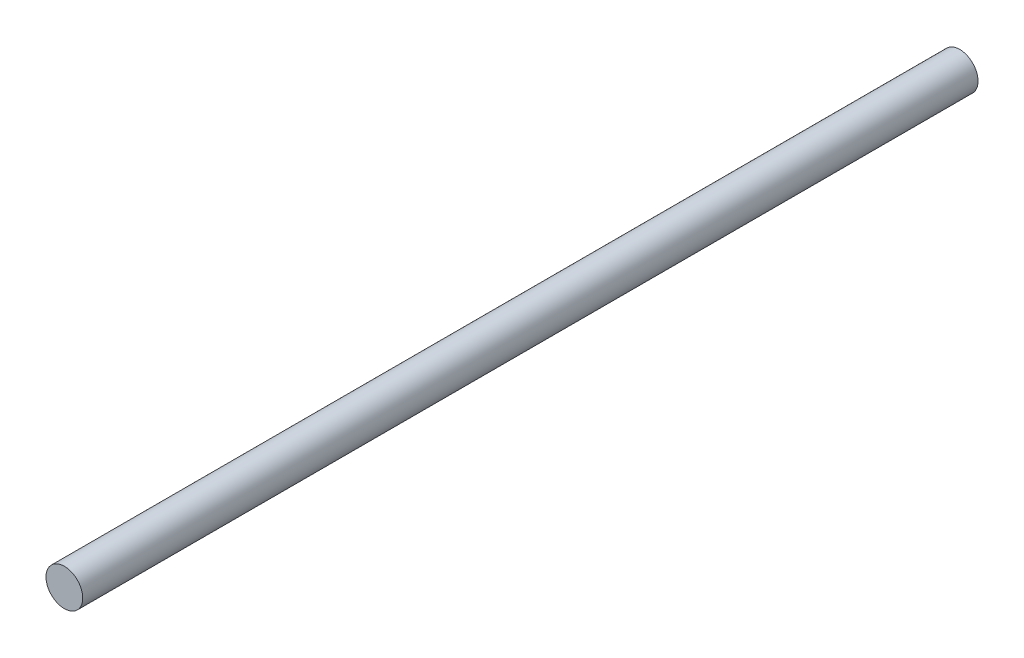
ISO-10303-21;
HEADER;
FILE_DESCRIPTION(('STEP AP214'),'2;1');
FILE_NAME('part.step','',(''),(''),'','','');
FILE_SCHEMA(('AUTOMOTIVE_DESIGN { 1 0 10303 214 1 1 1 1 }'));
ENDSEC;
DATA;
#1=APPLICATION_CONTEXT('core data for automotive mechanical design processes');
#2=APPLICATION_PROTOCOL_DEFINITION('international standard','automotive_design',2000,#1);
#3=PRODUCT_CONTEXT('',#1,'mechanical');
#4=PRODUCT('Part','Part','',(#3));
#5=PRODUCT_RELATED_PRODUCT_CATEGORY('part','',(#4));
#6=PRODUCT_DEFINITION_FORMATION('','',#4);
#7=PRODUCT_DEFINITION_CONTEXT('part definition',#1,'design');
#8=PRODUCT_DEFINITION('design','',#6,#7);
#9=PRODUCT_DEFINITION_SHAPE('','',#8);
#10=(LENGTH_UNIT() NAMED_UNIT(*) SI_UNIT(.MILLI.,.METRE.));
#11=(NAMED_UNIT(*) PLANE_ANGLE_UNIT() SI_UNIT($,.RADIAN.));
#12=(NAMED_UNIT(*) SI_UNIT($,.STERADIAN.) SOLID_ANGLE_UNIT());
#13=UNCERTAINTY_MEASURE_WITH_UNIT(LENGTH_MEASURE(1.E-05),#10,'distance_accuracy_value','');
#14=(GEOMETRIC_REPRESENTATION_CONTEXT(3) GLOBAL_UNCERTAINTY_ASSIGNED_CONTEXT((#13)) GLOBAL_UNIT_ASSIGNED_CONTEXT((#10,
#11,#12)) REPRESENTATION_CONTEXT('',''));
#15=CARTESIAN_POINT('',(0.,0.,0.));
#16=DIRECTION('',(0.,0.,1.));
#17=DIRECTION('',(1.,0.,0.));
#18=AXIS2_PLACEMENT_3D('',#15,#16,#17);
#19=CARTESIAN_POINT('',(0.,0.,1219.2));
#20=DIRECTION('',(0.,0.,-1.));
#21=DIRECTION('',(-1.,0.,0.));
#22=AXIS2_PLACEMENT_3D('',#19,#20,#21);
#23=CYLINDRICAL_SURFACE('',#22,25.);
#24=CARTESIAN_POINT('',(0.,0.,1219.2));
#25=DIRECTION('',(0.,0.,1.));
#26=DIRECTION('',(1.,0.,0.));
#27=AXIS2_PLACEMENT_3D('',#24,#25,#26);
#28=CIRCLE('',#27,25.);
#29=CARTESIAN_POINT('',(-25.,0.,1219.2));
#30=VERTEX_POINT('',#29);
#31=EDGE_CURVE('E10',#30,#30,#28,.T.);
#32=CARTESIAN_POINT('',(0.,0.,0.));
#33=DIRECTION('',(0.,0.,1.));
#34=DIRECTION('',(1.,0.,0.));
#35=AXIS2_PLACEMENT_3D('',#32,#33,#34);
#36=CIRCLE('',#35,25.);
#37=CARTESIAN_POINT('',(-25.,0.,0.));
#38=VERTEX_POINT('',#37);
#39=EDGE_CURVE('E42',#38,#38,#36,.T.);
#40=CARTESIAN_POINT('',(-25.,0.,1219.2));
#41=CARTESIAN_POINT('',(-25.,0.,1206.5));
#42=CARTESIAN_POINT('',(-25.,0.,1193.8));
#43=CARTESIAN_POINT('',(-25.,0.,1168.4));
#44=CARTESIAN_POINT('',(-25.,0.,1155.7));
#45=CARTESIAN_POINT('',(-25.,0.,1130.3));
#46=CARTESIAN_POINT('',(-25.,0.,1117.6));
#47=CARTESIAN_POINT('',(-25.,0.,1092.2));
#48=CARTESIAN_POINT('',(-25.,0.,1079.5));
#49=CARTESIAN_POINT('',(-25.,0.,1054.1));
#50=CARTESIAN_POINT('',(-25.,0.,1041.4));
#51=CARTESIAN_POINT('',(-25.,0.,1016.));
#52=CARTESIAN_POINT('',(-25.,0.,1003.3));
#53=CARTESIAN_POINT('',(-25.,0.,977.9));
#54=CARTESIAN_POINT('',(-25.,0.,965.2));
#55=CARTESIAN_POINT('',(-25.,0.,939.8));
#56=CARTESIAN_POINT('',(-25.,0.,927.1));
#57=CARTESIAN_POINT('',(-25.,0.,901.7));
#58=CARTESIAN_POINT('',(-25.,0.,889.));
#59=CARTESIAN_POINT('',(-25.,0.,863.6));
#60=CARTESIAN_POINT('',(-25.,0.,850.9));
#61=CARTESIAN_POINT('',(-25.,0.,825.5));
#62=CARTESIAN_POINT('',(-25.,0.,812.8));
#63=CARTESIAN_POINT('',(-25.,0.,787.4));
#64=CARTESIAN_POINT('',(-25.,0.,774.7));
#65=CARTESIAN_POINT('',(-25.,0.,749.3));
#66=CARTESIAN_POINT('',(-25.,0.,736.6));
#67=CARTESIAN_POINT('',(-25.,0.,711.2));
#68=CARTESIAN_POINT('',(-25.,0.,698.5));
#69=CARTESIAN_POINT('',(-25.,0.,673.1));
#70=CARTESIAN_POINT('',(-25.,0.,660.4));
#71=CARTESIAN_POINT('',(-25.,0.,635.));
#72=CARTESIAN_POINT('',(-25.,0.,622.3));
#73=CARTESIAN_POINT('',(-25.,0.,596.9));
#74=CARTESIAN_POINT('',(-25.,0.,584.2));
#75=CARTESIAN_POINT('',(-25.,0.,558.8));
#76=CARTESIAN_POINT('',(-25.,0.,546.1));
#77=CARTESIAN_POINT('',(-25.,0.,520.7));
#78=CARTESIAN_POINT('',(-25.,0.,508.));
#79=CARTESIAN_POINT('',(-25.,0.,482.6));
#80=CARTESIAN_POINT('',(-25.,0.,469.9));
#81=CARTESIAN_POINT('',(-25.,0.,444.5));
#82=CARTESIAN_POINT('',(-25.,0.,431.8));
#83=CARTESIAN_POINT('',(-25.,0.,406.4));
#84=CARTESIAN_POINT('',(-25.,0.,393.7));
#85=CARTESIAN_POINT('',(-25.,0.,368.3));
#86=CARTESIAN_POINT('',(-25.,0.,355.6));
#87=CARTESIAN_POINT('',(-25.,0.,330.2));
#88=CARTESIAN_POINT('',(-25.,0.,317.5));
#89=CARTESIAN_POINT('',(-25.,0.,292.1));
#90=CARTESIAN_POINT('',(-25.,0.,279.4));
#91=CARTESIAN_POINT('',(-25.,0.,254.));
#92=CARTESIAN_POINT('',(-25.,0.,241.3));
#93=CARTESIAN_POINT('',(-25.,0.,215.9));
#94=CARTESIAN_POINT('',(-25.,0.,203.2));
#95=CARTESIAN_POINT('',(-25.,0.,177.8));
#96=CARTESIAN_POINT('',(-25.,0.,165.1));
#97=CARTESIAN_POINT('',(-25.,0.,139.7));
#98=CARTESIAN_POINT('',(-25.,0.,127.));
#99=CARTESIAN_POINT('',(-25.,0.,101.6));
#100=CARTESIAN_POINT('',(-25.,0.,88.9));
#101=CARTESIAN_POINT('',(-25.,0.,63.5));
#102=CARTESIAN_POINT('',(-25.,0.,50.8));
#103=CARTESIAN_POINT('',(-25.,0.,25.4));
#104=CARTESIAN_POINT('',(-25.,0.,12.7));
#105=CARTESIAN_POINT('',(-25.,0.,0.));
#106=B_SPLINE_CURVE_WITH_KNOTS('',3,(#40,#41,#42,#43,#44,#45,#46,#47,#48,#49,#50,#51,#52,#53,
#54,#55,#56,#57,#58,#59,#60,#61,#62,#63,#64,#65,#66,#67,#68,#69,#70,#71,#72,#73,#74,#75,#76,#77,
#78,#79,#80,#81,#82,#83,#84,#85,#86,#87,#88,#89,#90,#91,#92,#93,#94,#95,#96,#97,#98,#99,#100,
#101,#102,#103,#104,#105),.UNSPECIFIED.,.F.,.F.,(4,2,2,2,2,2,2,2,2,2,2,2,2,2,2,2,2,2,2,2,2,2,2,
2,2,2,2,2,2,2,2,2,4),(0.,38.0999999999998,76.1999999999998,114.3,152.4,190.5,228.6,266.7,304.8,
342.9,381.,419.1,457.2,495.3,533.4,571.5,609.6,647.7,685.8,723.9,762.,800.1,838.2,876.3,914.4,
952.5,990.6,1028.7,1066.8,1104.9,1143.,1181.1,1219.2),.UNSPECIFIED.);
#107=EDGE_CURVE('BSEAM39',#30,#38,#106,.T.);
#108=ORIENTED_EDGE('',*,*,#31,.F.);
#109=ORIENTED_EDGE('',*,*,#39,.T.);
#110=ORIENTED_EDGE('',*,*,#107,.T.);
#111=ORIENTED_EDGE('',*,*,#107,.F.);
#112=EDGE_LOOP('',(#108,#110,#109,#111));
#113=FACE_BOUND('',#112,.T.);
#114=ADVANCED_FACE('F39',(#113),#23,.T.);
#115=CARTESIAN_POINT('',(0.,0.,1219.2));
#116=DIRECTION('',(0.,0.,1.));
#117=DIRECTION('',(1.,0.,0.));
#118=AXIS2_PLACEMENT_3D('',#115,#116,#117);
#119=PLANE('',#118);
#120=ORIENTED_EDGE('',*,*,#31,.T.);
#121=EDGE_LOOP('',(#120));
#122=FACE_BOUND('',#121,.T.);
#123=ADVANCED_FACE('F56',(#122),#119,.T.);
#124=CARTESIAN_POINT('',(0.,0.,0.));
#125=DIRECTION('',(0.,0.,1.));
#126=DIRECTION('',(1.,0.,0.));
#127=AXIS2_PLACEMENT_3D('',#124,#125,#126);
#128=PLANE('',#127);
#129=ORIENTED_EDGE('',*,*,#39,.F.);
#130=EDGE_LOOP('',(#129));
#131=FACE_BOUND('',#130,.T.);
#132=ADVANCED_FACE('F54',(#131),#128,.F.);
#133=CLOSED_SHELL('',(#114,#123,#132));
#134=MANIFOLD_SOLID_BREP('B2',#133);
#135=ADVANCED_BREP_SHAPE_REPRESENTATION('',(#18,#134),#14);
#136=SHAPE_DEFINITION_REPRESENTATION(#9,#135);
ENDSEC;
END-ISO-10303-21;
